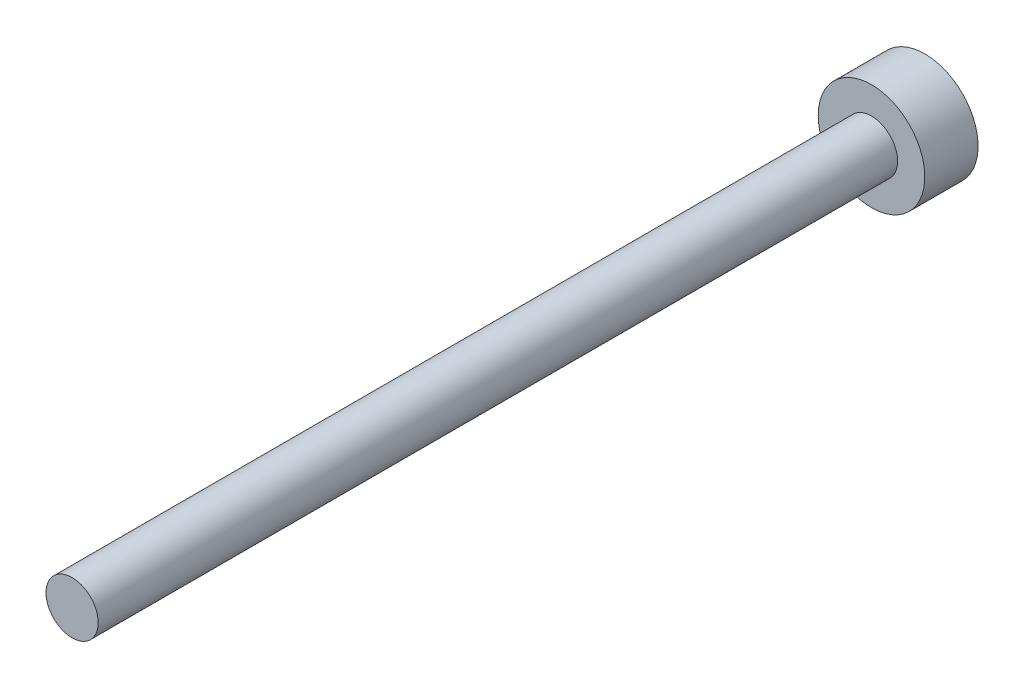
ISO-10303-21;
HEADER;
FILE_DESCRIPTION(('STEP AP214'),'2;1');
FILE_NAME('part.step','',(''),(''),'','','');
FILE_SCHEMA(('AUTOMOTIVE_DESIGN { 1 0 10303 214 1 1 1 1 }'));
ENDSEC;
DATA;
#1=APPLICATION_CONTEXT('core data for automotive mechanical design processes');
#2=APPLICATION_PROTOCOL_DEFINITION('international standard','automotive_design',2000,#1);
#3=PRODUCT_CONTEXT('',#1,'mechanical');
#4=PRODUCT('Part','Part','',(#3));
#5=PRODUCT_RELATED_PRODUCT_CATEGORY('part','',(#4));
#6=PRODUCT_DEFINITION_FORMATION('','',#4);
#7=PRODUCT_DEFINITION_CONTEXT('part definition',#1,'design');
#8=PRODUCT_DEFINITION('design','',#6,#7);
#9=PRODUCT_DEFINITION_SHAPE('','',#8);
#10=(LENGTH_UNIT() NAMED_UNIT(*) SI_UNIT(.MILLI.,.METRE.));
#11=(NAMED_UNIT(*) PLANE_ANGLE_UNIT() SI_UNIT($,.RADIAN.));
#12=(NAMED_UNIT(*) SI_UNIT($,.STERADIAN.) SOLID_ANGLE_UNIT());
#13=UNCERTAINTY_MEASURE_WITH_UNIT(LENGTH_MEASURE(1.E-05),#10,'distance_accuracy_value','');
#14=(GEOMETRIC_REPRESENTATION_CONTEXT(3) GLOBAL_UNCERTAINTY_ASSIGNED_CONTEXT((#13)) GLOBAL_UNIT_ASSIGNED_CONTEXT((#10,
#11,#12)) REPRESENTATION_CONTEXT('',''));
#15=CARTESIAN_POINT('',(0.,0.,0.));
#16=DIRECTION('',(0.,0.,1.));
#17=DIRECTION('',(1.,0.,0.));
#18=AXIS2_PLACEMENT_3D('',#15,#16,#17);
#19=CARTESIAN_POINT('',(0.,0.,79.9999999999998));
#20=DIRECTION('',(0.,0.,-1.));
#21=DIRECTION('',(-1.,0.,0.));
#22=AXIS2_PLACEMENT_3D('',#19,#20,#21);
#23=CYLINDRICAL_SURFACE('',#22,2.45);
#24=CARTESIAN_POINT('',(0.,0.,79.9999999999998));
#25=DIRECTION('',(0.,0.,1.));
#26=DIRECTION('',(1.,0.,0.));
#27=AXIS2_PLACEMENT_3D('',#24,#25,#26);
#28=CIRCLE('',#27,2.45);
#29=CARTESIAN_POINT('',(2.45,0.,79.9999999999998));
#30=VERTEX_POINT('',#29);
#31=EDGE_CURVE('E50',#30,#30,#28,.T.);
#32=ORIENTED_EDGE('',*,*,#31,.F.);
#33=EDGE_LOOP('',(#32));
#34=FACE_BOUND('',#33,.T.);
#35=CARTESIAN_POINT('',(0.,0.,5.));
#36=DIRECTION('',(0.,0.,-1.));
#37=DIRECTION('',(-1.,0.,0.));
#38=AXIS2_PLACEMENT_3D('',#35,#36,#37);
#39=CIRCLE('',#38,2.45);
#40=CARTESIAN_POINT('',(-2.45,0.,5.));
#41=VERTEX_POINT('',#40);
#42=EDGE_CURVE('E10',#41,#41,#39,.T.);
#43=ORIENTED_EDGE('',*,*,#42,.F.);
#44=EDGE_LOOP('',(#43));
#45=FACE_BOUND('',#44,.T.);
#46=ADVANCED_FACE('F43',(#34,#45),#23,.T.);
#47=CARTESIAN_POINT('',(0.,0.,79.9999999999998));
#48=DIRECTION('',(0.,0.,1.));
#49=DIRECTION('',(1.,0.,0.));
#50=AXIS2_PLACEMENT_3D('',#47,#48,#49);
#51=PLANE('',#50);
#52=ORIENTED_EDGE('',*,*,#31,.T.);
#53=EDGE_LOOP('',(#52));
#54=FACE_BOUND('',#53,.T.);
#55=ADVANCED_FACE('F72',(#54),#51,.T.);
#56=CARTESIAN_POINT('',(0.,0.,5.));
#57=DIRECTION('',(0.,0.,-1.));
#58=DIRECTION('',(-1.,0.,0.));
#59=AXIS2_PLACEMENT_3D('',#56,#57,#58);
#60=CYLINDRICAL_SURFACE('',#59,5.);
#61=CARTESIAN_POINT('',(0.,0.,5.));
#62=DIRECTION('',(0.,0.,-1.));
#63=DIRECTION('',(-1.,0.,0.));
#64=AXIS2_PLACEMENT_3D('',#61,#62,#63);
#65=CIRCLE('',#64,5.);
#66=CARTESIAN_POINT('',(-5.,0.,5.));
#67=VERTEX_POINT('',#66);
#68=EDGE_CURVE('E55',#67,#67,#65,.T.);
#69=ORIENTED_EDGE('',*,*,#68,.T.);
#70=EDGE_LOOP('',(#69));
#71=FACE_BOUND('',#70,.T.);
#72=CARTESIAN_POINT('',(0.,0.,0.));
#73=DIRECTION('',(0.,0.,-1.));
#74=DIRECTION('',(-1.,0.,0.));
#75=AXIS2_PLACEMENT_3D('',#72,#73,#74);
#76=CIRCLE('',#75,5.);
#77=CARTESIAN_POINT('',(-5.,0.,0.));
#78=VERTEX_POINT('',#77);
#79=EDGE_CURVE('E60',#78,#78,#76,.T.);
#80=ORIENTED_EDGE('',*,*,#79,.F.);
#81=EDGE_LOOP('',(#80));
#82=FACE_BOUND('',#81,.T.);
#83=ADVANCED_FACE('F69',(#71,#82),#60,.T.);
#84=CARTESIAN_POINT('',(0.,0.,5.));
#85=DIRECTION('',(0.,0.,-1.));
#86=DIRECTION('',(-1.,0.,0.));
#87=AXIS2_PLACEMENT_3D('',#84,#85,#86);
#88=PLANE('',#87);
#89=ORIENTED_EDGE('',*,*,#42,.T.);
#90=EDGE_LOOP('',(#89));
#91=FACE_BOUND('',#90,.T.);
#92=ORIENTED_EDGE('',*,*,#68,.F.);
#93=EDGE_LOOP('',(#92));
#94=FACE_BOUND('',#93,.T.);
#95=ADVANCED_FACE('F71',(#91,#94),#88,.F.);
#96=CARTESIAN_POINT('',(0.,0.,0.));
#97=DIRECTION('',(0.,0.,1.));
#98=DIRECTION('',(1.,0.,0.));
#99=AXIS2_PLACEMENT_3D('',#96,#97,#98);
#100=PLANE('',#99);
#101=ORIENTED_EDGE('',*,*,#79,.T.);
#102=EDGE_LOOP('',(#101));
#103=FACE_BOUND('',#102,.T.);
#104=ADVANCED_FACE('F67',(#103),#100,.F.);
#105=CLOSED_SHELL('',(#46,#55,#83,#95,#104));
#106=MANIFOLD_SOLID_BREP('B2',#105);
#107=ADVANCED_BREP_SHAPE_REPRESENTATION('',(#18,#106),#14);
#108=SHAPE_DEFINITION_REPRESENTATION(#9,#107);
ENDSEC;
END-ISO-10303-21;
